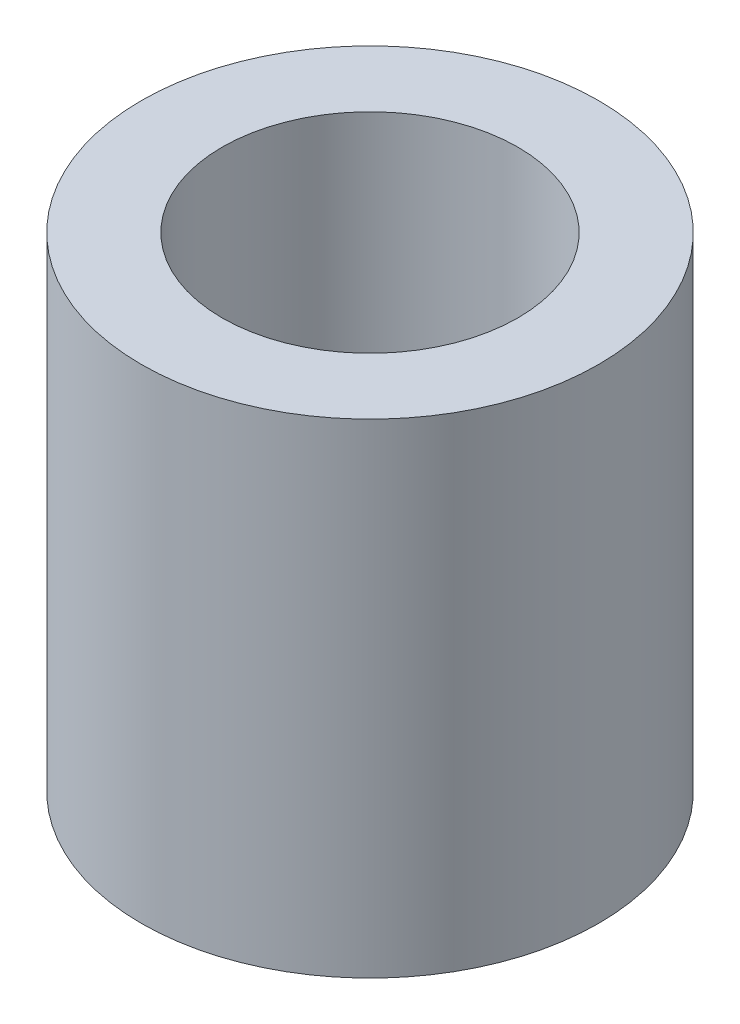
ISO-10303-21;
HEADER;
FILE_DESCRIPTION(('STEP AP214'),'2;1');
FILE_NAME('part.step','',(''),(''),'','','');
FILE_SCHEMA(('AUTOMOTIVE_DESIGN { 1 0 10303 214 1 1 1 1 }'));
ENDSEC;
DATA;
#1=APPLICATION_CONTEXT('core data for automotive mechanical design processes');
#2=APPLICATION_PROTOCOL_DEFINITION('international standard','automotive_design',2000,#1);
#3=PRODUCT_CONTEXT('',#1,'mechanical');
#4=PRODUCT('Part','Part','',(#3));
#5=PRODUCT_RELATED_PRODUCT_CATEGORY('part','',(#4));
#6=PRODUCT_DEFINITION_FORMATION('','',#4);
#7=PRODUCT_DEFINITION_CONTEXT('part definition',#1,'design');
#8=PRODUCT_DEFINITION('design','',#6,#7);
#9=PRODUCT_DEFINITION_SHAPE('','',#8);
#10=(LENGTH_UNIT() NAMED_UNIT(*) SI_UNIT(.MILLI.,.METRE.));
#11=(NAMED_UNIT(*) PLANE_ANGLE_UNIT() SI_UNIT($,.RADIAN.));
#12=(NAMED_UNIT(*) SI_UNIT($,.STERADIAN.) SOLID_ANGLE_UNIT());
#13=UNCERTAINTY_MEASURE_WITH_UNIT(LENGTH_MEASURE(1.E-05),#10,'distance_accuracy_value','');
#14=(GEOMETRIC_REPRESENTATION_CONTEXT(3) GLOBAL_UNCERTAINTY_ASSIGNED_CONTEXT((#13)) GLOBAL_UNIT_ASSIGNED_CONTEXT((#10,
#11,#12)) REPRESENTATION_CONTEXT('',''));
#15=CARTESIAN_POINT('',(0.,0.,0.));
#16=DIRECTION('',(0.,0.,1.));
#17=DIRECTION('',(1.,0.,0.));
#18=AXIS2_PLACEMENT_3D('',#15,#16,#17);
#19=CARTESIAN_POINT('',(0.,9.,0.));
#20=DIRECTION('',(0.,1.,0.));
#21=DIRECTION('',(0.,0.,1.));
#22=AXIS2_PLACEMENT_3D('',#19,#20,#21);
#23=PLANE('',#22);
#24=CARTESIAN_POINT('',(0.,9.,0.));
#25=DIRECTION('',(0.,1.,0.));
#26=DIRECTION('',(0.,0.,1.));
#27=AXIS2_PLACEMENT_3D('',#24,#25,#26);
#28=CIRCLE('',#27,4.25);
#29=CARTESIAN_POINT('',(0.,9.,4.25));
#30=VERTEX_POINT('',#29);
#31=EDGE_CURVE('E10',#30,#30,#28,.T.);
#32=ORIENTED_EDGE('',*,*,#31,.T.);
#33=EDGE_LOOP('',(#32));
#34=FACE_BOUND('',#33,.T.);
#35=CARTESIAN_POINT('',(0.,9.,0.));
#36=DIRECTION('',(0.,1.,0.));
#37=DIRECTION('',(0.,0.,1.));
#38=AXIS2_PLACEMENT_3D('',#35,#36,#37);
#39=CIRCLE('',#38,2.75);
#40=CARTESIAN_POINT('',(0.,9.,2.75));
#41=VERTEX_POINT('',#40);
#42=EDGE_CURVE('E48',#41,#41,#39,.T.);
#43=ORIENTED_EDGE('',*,*,#42,.F.);
#44=EDGE_LOOP('',(#43));
#45=FACE_BOUND('',#44,.T.);
#46=ADVANCED_FACE('F40',(#34,#45),#23,.T.);
#47=CARTESIAN_POINT('',(0.,0.,0.));
#48=DIRECTION('',(0.,1.,0.));
#49=DIRECTION('',(0.,0.,1.));
#50=AXIS2_PLACEMENT_3D('',#47,#48,#49);
#51=PLANE('',#50);
#52=CARTESIAN_POINT('',(0.,0.,0.));
#53=DIRECTION('',(0.,1.,0.));
#54=DIRECTION('',(0.,0.,1.));
#55=AXIS2_PLACEMENT_3D('',#52,#53,#54);
#56=CIRCLE('',#55,4.25);
#57=CARTESIAN_POINT('',(0.,0.,4.25));
#58=VERTEX_POINT('',#57);
#59=EDGE_CURVE('E41',#58,#58,#56,.T.);
#60=ORIENTED_EDGE('',*,*,#59,.F.);
#61=EDGE_LOOP('',(#60));
#62=FACE_BOUND('',#61,.T.);
#63=CARTESIAN_POINT('',(0.,0.,0.));
#64=DIRECTION('',(0.,1.,0.));
#65=DIRECTION('',(0.,0.,1.));
#66=AXIS2_PLACEMENT_3D('',#63,#64,#65);
#67=CIRCLE('',#66,2.75);
#68=CARTESIAN_POINT('',(0.,0.,2.75));
#69=VERTEX_POINT('',#68);
#70=EDGE_CURVE('E49',#69,#69,#67,.T.);
#71=ORIENTED_EDGE('',*,*,#70,.T.);
#72=EDGE_LOOP('',(#71));
#73=FACE_BOUND('',#72,.T.);
#74=ADVANCED_FACE('F58',(#62,#73),#51,.F.);
#75=CARTESIAN_POINT('',(0.,9.,0.));
#76=DIRECTION('',(0.,-1.,0.));
#77=DIRECTION('',(0.,0.,-1.));
#78=AXIS2_PLACEMENT_3D('',#75,#76,#77);
#79=CYLINDRICAL_SURFACE('',#78,4.25);
#80=ORIENTED_EDGE('',*,*,#31,.F.);
#81=EDGE_LOOP('',(#80));
#82=FACE_BOUND('',#81,.T.);
#83=ORIENTED_EDGE('',*,*,#59,.T.);
#84=EDGE_LOOP('',(#83));
#85=FACE_BOUND('',#84,.T.);
#86=ADVANCED_FACE('F39',(#82,#85),#79,.T.);
#87=CARTESIAN_POINT('',(0.,9.,0.));
#88=DIRECTION('',(0.,-1.,0.));
#89=DIRECTION('',(0.,0.,-1.));
#90=AXIS2_PLACEMENT_3D('',#87,#88,#89);
#91=CYLINDRICAL_SURFACE('',#90,2.75);
#92=ORIENTED_EDGE('',*,*,#42,.T.);
#93=EDGE_LOOP('',(#92));
#94=FACE_BOUND('',#93,.T.);
#95=ORIENTED_EDGE('',*,*,#70,.F.);
#96=EDGE_LOOP('',(#95));
#97=FACE_BOUND('',#96,.T.);
#98=ADVANCED_FACE('F57',(#94,#97),#91,.F.);
#99=CLOSED_SHELL('',(#46,#74,#86,#98));
#100=MANIFOLD_SOLID_BREP('B2',#99);
#101=ADVANCED_BREP_SHAPE_REPRESENTATION('',(#18,#100),#14);
#102=SHAPE_DEFINITION_REPRESENTATION(#9,#101);
ENDSEC;
END-ISO-10303-21;
